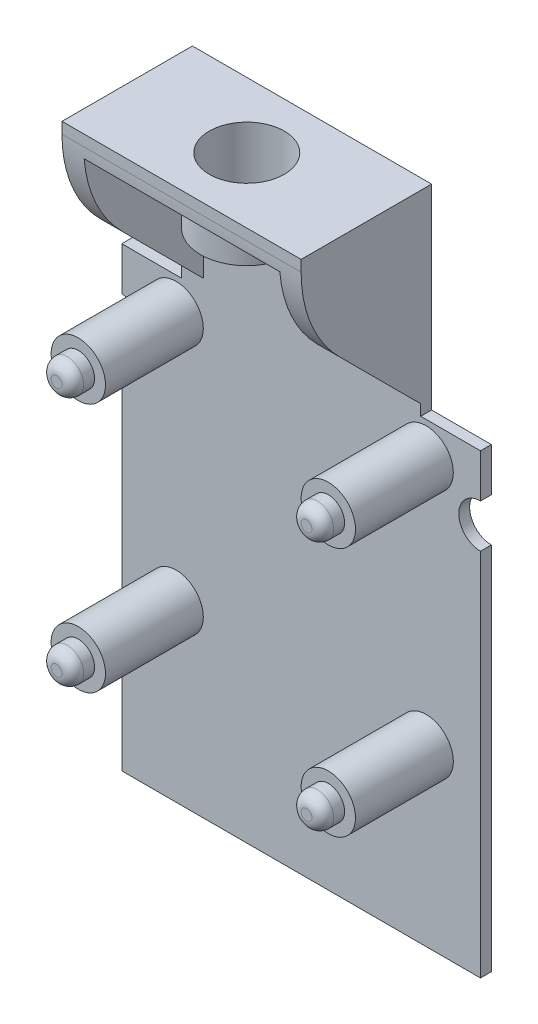
ISO-10303-21;
HEADER;
FILE_DESCRIPTION(('STEP AP214'),'2;1');
FILE_NAME('part.step','',(''),(''),'','','');
FILE_SCHEMA(('AUTOMOTIVE_DESIGN { 1 0 10303 214 1 1 1 1 }'));
ENDSEC;
DATA;
#1=APPLICATION_CONTEXT('core data for automotive mechanical design processes');
#2=APPLICATION_PROTOCOL_DEFINITION('international standard','automotive_design',2000,#1);
#3=PRODUCT_CONTEXT('',#1,'mechanical');
#4=PRODUCT('Part','Part','',(#3));
#5=PRODUCT_RELATED_PRODUCT_CATEGORY('part','',(#4));
#6=PRODUCT_DEFINITION_FORMATION('','',#4);
#7=PRODUCT_DEFINITION_CONTEXT('part definition',#1,'design');
#8=PRODUCT_DEFINITION('design','',#6,#7);
#9=PRODUCT_DEFINITION_SHAPE('','',#8);
#10=(LENGTH_UNIT() NAMED_UNIT(*) SI_UNIT(.MILLI.,.METRE.));
#11=(NAMED_UNIT(*) PLANE_ANGLE_UNIT() SI_UNIT($,.RADIAN.));
#12=(NAMED_UNIT(*) SI_UNIT($,.STERADIAN.) SOLID_ANGLE_UNIT());
#13=UNCERTAINTY_MEASURE_WITH_UNIT(LENGTH_MEASURE(1.E-05),#10,'distance_accuracy_value','');
#14=(GEOMETRIC_REPRESENTATION_CONTEXT(3) GLOBAL_UNCERTAINTY_ASSIGNED_CONTEXT((#13)) GLOBAL_UNIT_ASSIGNED_CONTEXT((#10,
#11,#12)) REPRESENTATION_CONTEXT('',''));
#15=CARTESIAN_POINT('',(0.,0.,0.));
#16=DIRECTION('',(0.,0.,1.));
#17=DIRECTION('',(1.,0.,0.));
#18=AXIS2_PLACEMENT_3D('',#15,#16,#17);
#19=CARTESIAN_POINT('',(0.,12.,1.));
#20=DIRECTION('',(0.,1.,0.));
#21=DIRECTION('',(0.,0.,1.));
#22=AXIS2_PLACEMENT_3D('',#19,#20,#21);
#23=PLANE('',#22);
#24=DIRECTION('',(1.,0.,0.));
#25=VECTOR('',#24,1.);
#26=CARTESIAN_POINT('',(0.,12.,1.));
#27=LINE('',#26,#25);
#28=CARTESIAN_POINT('',(-16.5,12.,1.));
#29=VERTEX_POINT('',#28);
#30=CARTESIAN_POINT('',(-11.,12.,1.));
#31=VERTEX_POINT('',#30);
#32=EDGE_CURVE('E256',#29,#31,#27,.T.);
#33=ORIENTED_EDGE('',*,*,#32,.T.);
#34=DIRECTION('',(0.,0.,-1.));
#35=VECTOR('',#34,1.);
#36=CARTESIAN_POINT('',(-11.,12.,12.));
#37=LINE('',#36,#35);
#38=CARTESIAN_POINT('',(-11.,12.,0.));
#39=VERTEX_POINT('',#38);
#40=EDGE_CURVE('E194',#31,#39,#37,.T.);
#41=ORIENTED_EDGE('',*,*,#40,.T.);
#42=DIRECTION('',(1.,0.,0.));
#43=VECTOR('',#42,1.);
#44=CARTESIAN_POINT('',(0.,12.,0.));
#45=LINE('',#44,#43);
#46=CARTESIAN_POINT('',(-16.5,12.,0.));
#47=VERTEX_POINT('',#46);
#48=EDGE_CURVE('E287',#47,#39,#45,.T.);
#49=ORIENTED_EDGE('',*,*,#48,.F.);
#50=DIRECTION('',(0.,0.,-1.));
#51=VECTOR('',#50,1.);
#52=CARTESIAN_POINT('',(-16.5,12.,1.));
#53=LINE('',#52,#51);
#54=EDGE_CURVE('E310',#29,#47,#53,.T.);
#55=ORIENTED_EDGE('',*,*,#54,.F.);
#56=EDGE_LOOP('',(#33,#41,#49,#55));
#57=FACE_BOUND('',#56,.T.);
#58=ADVANCED_FACE('F35',(#57),#23,.T.);
#59=CARTESIAN_POINT('',(16.5,5.99999999999997,1.));
#60=DIRECTION('',(0.,0.,-1.));
#61=DIRECTION('',(-1.,0.,0.));
#62=AXIS2_PLACEMENT_3D('',#59,#60,#61);
#63=CYLINDRICAL_SURFACE('',#62,2.);
#64=CARTESIAN_POINT('',(16.5,5.99999999999997,0.));
#65=DIRECTION('',(0.,0.,1.));
#66=DIRECTION('',(1.,0.,0.));
#67=AXIS2_PLACEMENT_3D('',#64,#65,#66);
#68=CIRCLE('',#67,2.);
#69=CARTESIAN_POINT('',(16.5,7.99999999999997,0.));
#70=VERTEX_POINT('',#69);
#71=CARTESIAN_POINT('',(16.5,3.99999999999997,0.));
#72=VERTEX_POINT('',#71);
#73=EDGE_CURVE('E235',#70,#72,#68,.T.);
#74=ORIENTED_EDGE('',*,*,#73,.F.);
#75=DIRECTION('',(0.,0.,-1.));
#76=VECTOR('',#75,1.);
#77=CARTESIAN_POINT('',(16.5,7.99999999999997,1.));
#78=LINE('',#77,#76);
#79=CARTESIAN_POINT('',(16.5,7.99999999999997,1.));
#80=VERTEX_POINT('',#79);
#81=EDGE_CURVE('E314',#80,#70,#78,.T.);
#82=ORIENTED_EDGE('',*,*,#81,.F.);
#83=CARTESIAN_POINT('',(16.5,5.99999999999997,1.));
#84=DIRECTION('',(0.,0.,1.));
#85=DIRECTION('',(1.,0.,0.));
#86=AXIS2_PLACEMENT_3D('',#83,#84,#85);
#87=CIRCLE('',#86,2.);
#88=CARTESIAN_POINT('',(16.5,3.99999999999997,1.));
#89=VERTEX_POINT('',#88);
#90=EDGE_CURVE('E236',#80,#89,#87,.T.);
#91=ORIENTED_EDGE('',*,*,#90,.T.);
#92=DIRECTION('',(0.,0.,-1.));
#93=VECTOR('',#92,1.);
#94=CARTESIAN_POINT('',(16.5,3.99999999999997,1.));
#95=LINE('',#94,#93);
#96=EDGE_CURVE('E278',#89,#72,#95,.T.);
#97=ORIENTED_EDGE('',*,*,#96,.T.);
#98=EDGE_LOOP('',(#74,#82,#91,#97));
#99=FACE_BOUND('',#98,.T.);
#100=ADVANCED_FACE('F437',(#99),#63,.F.);
#101=CARTESIAN_POINT('',(16.5,0.,1.));
#102=DIRECTION('',(1.,0.,0.));
#103=DIRECTION('',(0.,1.,0.));
#104=AXIS2_PLACEMENT_3D('',#101,#102,#103);
#105=PLANE('',#104);
#106=DIRECTION('',(0.,-1.,0.));
#107=VECTOR('',#106,1.);
#108=CARTESIAN_POINT('',(16.5,0.,0.));
#109=LINE('',#108,#107);
#110=CARTESIAN_POINT('',(16.5,12.,0.));
#111=VERTEX_POINT('',#110);
#112=EDGE_CURVE('E281',#111,#70,#109,.T.);
#113=ORIENTED_EDGE('',*,*,#112,.F.);
#114=DIRECTION('',(0.,0.,-1.));
#115=VECTOR('',#114,1.);
#116=CARTESIAN_POINT('',(16.5,12.,1.));
#117=LINE('',#116,#115);
#118=CARTESIAN_POINT('',(16.5,12.,1.));
#119=VERTEX_POINT('',#118);
#120=EDGE_CURVE('E312',#119,#111,#117,.T.);
#121=ORIENTED_EDGE('',*,*,#120,.F.);
#122=DIRECTION('',(0.,-1.,0.));
#123=VECTOR('',#122,1.);
#124=CARTESIAN_POINT('',(16.5,0.,1.));
#125=LINE('',#124,#123);
#126=EDGE_CURVE('E239',#119,#80,#125,.T.);
#127=ORIENTED_EDGE('',*,*,#126,.T.);
#128=ORIENTED_EDGE('',*,*,#81,.T.);
#129=EDGE_LOOP('',(#113,#121,#127,#128));
#130=FACE_BOUND('',#129,.T.);
#131=ADVANCED_FACE('F439',(#130),#105,.T.);
#132=CARTESIAN_POINT('',(0.,12.,1.));
#133=DIRECTION('',(0.,-1.,0.));
#134=DIRECTION('',(0.,0.,-1.));
#135=AXIS2_PLACEMENT_3D('',#132,#133,#134);
#136=PLANE('',#135);
#137=DIRECTION('',(-1.,0.,0.));
#138=VECTOR('',#137,1.);
#139=CARTESIAN_POINT('',(0.,12.,0.));
#140=LINE('',#139,#138);
#141=CARTESIAN_POINT('',(11.,12.,0.));
#142=VERTEX_POINT('',#141);
#143=EDGE_CURVE('E284',#111,#142,#140,.T.);
#144=ORIENTED_EDGE('',*,*,#143,.T.);
#145=DIRECTION('',(0.,0.,-1.));
#146=VECTOR('',#145,1.);
#147=CARTESIAN_POINT('',(11.,12.,12.));
#148=LINE('',#147,#146);
#149=CARTESIAN_POINT('',(11.,12.,1.));
#150=VERTEX_POINT('',#149);
#151=EDGE_CURVE('E176',#150,#142,#148,.T.);
#152=ORIENTED_EDGE('',*,*,#151,.F.);
#153=DIRECTION('',(-1.,0.,0.));
#154=VECTOR('',#153,1.);
#155=CARTESIAN_POINT('',(0.,12.,1.));
#156=LINE('',#155,#154);
#157=EDGE_CURVE('E243',#119,#150,#156,.T.);
#158=ORIENTED_EDGE('',*,*,#157,.F.);
#159=ORIENTED_EDGE('',*,*,#120,.T.);
#160=EDGE_LOOP('',(#144,#152,#158,#159));
#161=FACE_BOUND('',#160,.T.);
#162=ADVANCED_FACE('F401',(#161),#136,.F.);
#163=CARTESIAN_POINT('',(-16.5,0.,1.));
#164=DIRECTION('',(1.,0.,0.));
#165=DIRECTION('',(0.,1.,0.));
#166=AXIS2_PLACEMENT_3D('',#163,#164,#165);
#167=PLANE('',#166);
#168=DIRECTION('',(0.,-1.,0.));
#169=VECTOR('',#168,1.);
#170=CARTESIAN_POINT('',(-16.5,0.,0.));
#171=LINE('',#170,#169);
#172=CARTESIAN_POINT('',(-16.5,8.,0.));
#173=VERTEX_POINT('',#172);
#174=EDGE_CURVE('E290',#47,#173,#171,.T.);
#175=ORIENTED_EDGE('',*,*,#174,.T.);
#176=DIRECTION('',(0.,0.,-1.));
#177=VECTOR('',#176,1.);
#178=CARTESIAN_POINT('',(-16.5,8.,1.));
#179=LINE('',#178,#177);
#180=CARTESIAN_POINT('',(-16.5,8.,1.));
#181=VERTEX_POINT('',#180);
#182=EDGE_CURVE('E307',#181,#173,#179,.T.);
#183=ORIENTED_EDGE('',*,*,#182,.F.);
#184=DIRECTION('',(0.,-1.,0.));
#185=VECTOR('',#184,1.);
#186=CARTESIAN_POINT('',(-16.5,0.,1.));
#187=LINE('',#186,#185);
#188=EDGE_CURVE('E259',#29,#181,#187,.T.);
#189=ORIENTED_EDGE('',*,*,#188,.F.);
#190=ORIENTED_EDGE('',*,*,#54,.T.);
#191=EDGE_LOOP('',(#175,#183,#189,#190));
#192=FACE_BOUND('',#191,.T.);
#193=ADVANCED_FACE('F415',(#192),#167,.F.);
#194=CARTESIAN_POINT('',(-16.5,6.,1.));
#195=DIRECTION('',(0.,0.,-1.));
#196=DIRECTION('',(-1.,0.,0.));
#197=AXIS2_PLACEMENT_3D('',#194,#195,#196);
#198=CYLINDRICAL_SURFACE('',#197,2.);
#199=CARTESIAN_POINT('',(-16.5,6.,0.));
#200=DIRECTION('',(0.,0.,1.));
#201=DIRECTION('',(1.,0.,0.));
#202=AXIS2_PLACEMENT_3D('',#199,#200,#201);
#203=CIRCLE('',#202,2.);
#204=CARTESIAN_POINT('',(-16.5,4.,0.));
#205=VERTEX_POINT('',#204);
#206=EDGE_CURVE('E292',#173,#205,#203,.F.);
#207=ORIENTED_EDGE('',*,*,#206,.T.);
#208=DIRECTION('',(0.,0.,-1.));
#209=VECTOR('',#208,1.);
#210=CARTESIAN_POINT('',(-16.5,4.,1.));
#211=LINE('',#210,#209);
#212=CARTESIAN_POINT('',(-16.5,4.,1.));
#213=VERTEX_POINT('',#212);
#214=EDGE_CURVE('E304',#213,#205,#211,.T.);
#215=ORIENTED_EDGE('',*,*,#214,.F.);
#216=CARTESIAN_POINT('',(-16.5,6.,1.));
#217=DIRECTION('',(0.,0.,1.));
#218=DIRECTION('',(1.,0.,0.));
#219=AXIS2_PLACEMENT_3D('',#216,#217,#218);
#220=CIRCLE('',#219,2.);
#221=EDGE_CURVE('E261',#181,#213,#220,.F.);
#222=ORIENTED_EDGE('',*,*,#221,.F.);
#223=ORIENTED_EDGE('',*,*,#182,.T.);
#224=EDGE_LOOP('',(#207,#215,#222,#223));
#225=FACE_BOUND('',#224,.T.);
#226=ADVANCED_FACE('F418',(#225),#198,.F.);
#227=CARTESIAN_POINT('',(-16.5,-30.,0.));
#228=VERTEX_POINT('',#227);
#229=EDGE_CURVE('E293',#205,#228,#171,.T.);
#230=ORIENTED_EDGE('',*,*,#229,.T.);
#231=DIRECTION('',(0.,0.,-1.));
#232=VECTOR('',#231,1.);
#233=CARTESIAN_POINT('',(-16.5,-30.,1.));
#234=LINE('',#233,#232);
#235=CARTESIAN_POINT('',(-16.5,-30.,1.));
#236=VERTEX_POINT('',#235);
#237=EDGE_CURVE('E301',#236,#228,#234,.T.);
#238=ORIENTED_EDGE('',*,*,#237,.F.);
#239=EDGE_CURVE('E262',#213,#236,#187,.T.);
#240=ORIENTED_EDGE('',*,*,#239,.F.);
#241=ORIENTED_EDGE('',*,*,#214,.T.);
#242=EDGE_LOOP('',(#230,#238,#240,#241));
#243=FACE_BOUND('',#242,.T.);
#244=ADVANCED_FACE('F423',(#243),#167,.F.);
#245=CARTESIAN_POINT('',(0.,-30.,1.));
#246=DIRECTION('',(0.,1.,0.));
#247=DIRECTION('',(0.,0.,1.));
#248=AXIS2_PLACEMENT_3D('',#245,#246,#247);
#249=PLANE('',#248);
#250=DIRECTION('',(1.,0.,0.));
#251=VECTOR('',#250,1.);
#252=CARTESIAN_POINT('',(0.,-30.,0.));
#253=LINE('',#252,#251);
#254=CARTESIAN_POINT('',(16.5,-30.,0.));
#255=VERTEX_POINT('',#254);
#256=EDGE_CURVE('E295',#228,#255,#253,.T.);
#257=ORIENTED_EDGE('',*,*,#256,.T.);
#258=DIRECTION('',(0.,0.,-1.));
#259=VECTOR('',#258,1.);
#260=CARTESIAN_POINT('',(16.5,-30.,1.));
#261=LINE('',#260,#259);
#262=CARTESIAN_POINT('',(16.5,-30.,1.));
#263=VERTEX_POINT('',#262);
#264=EDGE_CURVE('E299',#263,#255,#261,.T.);
#265=ORIENTED_EDGE('',*,*,#264,.F.);
#266=DIRECTION('',(1.,0.,0.));
#267=VECTOR('',#266,1.);
#268=CARTESIAN_POINT('',(0.,-30.,1.));
#269=LINE('',#268,#267);
#270=EDGE_CURVE('E264',#236,#263,#269,.T.);
#271=ORIENTED_EDGE('',*,*,#270,.F.);
#272=ORIENTED_EDGE('',*,*,#237,.T.);
#273=EDGE_LOOP('',(#257,#265,#271,#272));
#274=FACE_BOUND('',#273,.T.);
#275=ADVANCED_FACE('F429',(#274),#249,.F.);
#276=EDGE_CURVE('E240',#72,#255,#109,.T.);
#277=ORIENTED_EDGE('',*,*,#276,.F.);
#278=ORIENTED_EDGE('',*,*,#96,.F.);
#279=EDGE_CURVE('E244',#89,#263,#125,.T.);
#280=ORIENTED_EDGE('',*,*,#279,.T.);
#281=ORIENTED_EDGE('',*,*,#264,.T.);
#282=EDGE_LOOP('',(#277,#278,#280,#281));
#283=FACE_BOUND('',#282,.T.);
#284=ADVANCED_FACE('F434',(#283),#105,.T.);
#285=CARTESIAN_POINT('',(0.,0.,1.));
#286=DIRECTION('',(0.,0.,1.));
#287=DIRECTION('',(1.,0.,0.));
#288=AXIS2_PLACEMENT_3D('',#285,#286,#287);
#289=PLANE('',#288);
#290=ORIENTED_EDGE('',*,*,#90,.F.);
#291=ORIENTED_EDGE('',*,*,#126,.F.);
#292=ORIENTED_EDGE('',*,*,#157,.T.);
#293=DIRECTION('',(0.,-1.,0.));
#294=VECTOR('',#293,1.);
#295=CARTESIAN_POINT('',(11.,0.,1.));
#296=LINE('',#295,#294);
#297=CARTESIAN_POINT('',(11.,13.0000000000002,1.));
#298=VERTEX_POINT('',#297);
#299=EDGE_CURVE('E352',#298,#150,#296,.T.);
#300=ORIENTED_EDGE('',*,*,#299,.F.);
#301=DIRECTION('',(1.,0.,0.));
#302=VECTOR('',#301,1.);
#303=CARTESIAN_POINT('',(0.,13.0000000000002,1.));
#304=LINE('',#303,#302);
#305=CARTESIAN_POINT('',(9.,13.0000000000002,1.));
#306=VERTEX_POINT('',#305);
#307=EDGE_CURVE('E356',#298,#306,#304,.F.);
#308=ORIENTED_EDGE('',*,*,#307,.T.);
#309=DIRECTION('',(0.,-1.,0.));
#310=VECTOR('',#309,1.);
#311=CARTESIAN_POINT('',(9.,0.,1.));
#312=LINE('',#311,#310);
#313=CARTESIAN_POINT('',(9.,28.,1.));
#314=VERTEX_POINT('',#313);
#315=EDGE_CURVE('E247',#314,#306,#312,.T.);
#316=ORIENTED_EDGE('',*,*,#315,.F.);
#317=DIRECTION('',(1.,0.,0.));
#318=VECTOR('',#317,1.);
#319=CARTESIAN_POINT('',(0.,28.,1.));
#320=LINE('',#319,#318);
#321=CARTESIAN_POINT('',(-9.,28.,1.));
#322=VERTEX_POINT('',#321);
#323=EDGE_CURVE('E250',#322,#314,#320,.T.);
#324=ORIENTED_EDGE('',*,*,#323,.F.);
#325=DIRECTION('',(0.,-1.,0.));
#326=VECTOR('',#325,1.);
#327=CARTESIAN_POINT('',(-9.,0.,1.));
#328=LINE('',#327,#326);
#329=CARTESIAN_POINT('',(-9.,13.0000000000001,1.));
#330=VERTEX_POINT('',#329);
#331=EDGE_CURVE('E253',#322,#330,#328,.T.);
#332=ORIENTED_EDGE('',*,*,#331,.T.);
#333=DIRECTION('',(-1.,0.,0.));
#334=VECTOR('',#333,1.);
#335=CARTESIAN_POINT('',(0.,13.0000000000001,1.));
#336=LINE('',#335,#334);
#337=CARTESIAN_POINT('',(-11.,13.0000000000001,1.));
#338=VERTEX_POINT('',#337);
#339=EDGE_CURVE('E354',#330,#338,#336,.T.);
#340=ORIENTED_EDGE('',*,*,#339,.T.);
#341=DIRECTION('',(0.,1.,0.));
#342=VECTOR('',#341,1.);
#343=CARTESIAN_POINT('',(-11.,0.,1.));
#344=LINE('',#343,#342);
#345=EDGE_CURVE('E344',#31,#338,#344,.T.);
#346=ORIENTED_EDGE('',*,*,#345,.F.);
#347=ORIENTED_EDGE('',*,*,#32,.F.);
#348=ORIENTED_EDGE('',*,*,#188,.T.);
#349=ORIENTED_EDGE('',*,*,#221,.T.);
#350=ORIENTED_EDGE('',*,*,#239,.T.);
#351=ORIENTED_EDGE('',*,*,#270,.T.);
#352=ORIENTED_EDGE('',*,*,#279,.F.);
#353=EDGE_LOOP('',(#290,#291,#292,#300,#308,#316,#324,#332,#340,#346,#347,#348,#349,#350,#351,#352));
#354=FACE_BOUND('',#353,.T.);
#355=CARTESIAN_POINT('',(-11.5,-14.,1.));
#356=DIRECTION('',(0.,0.,1.));
#357=DIRECTION('',(1.,0.,0.));
#358=AXIS2_PLACEMENT_3D('',#355,#356,#357);
#359=CIRCLE('',#358,2.5);
#360=CARTESIAN_POINT('',(-9.,-14.,1.));
#361=VERTEX_POINT('',#360);
#362=EDGE_CURVE('E266',#361,#361,#359,.T.);
#363=ORIENTED_EDGE('',*,*,#362,.F.);
#364=EDGE_LOOP('',(#363));
#365=FACE_BOUND('',#364,.T.);
#366=CARTESIAN_POINT('',(11.5,-14.,1.));
#367=DIRECTION('',(0.,0.,1.));
#368=DIRECTION('',(1.,0.,0.));
#369=AXIS2_PLACEMENT_3D('',#366,#367,#368);
#370=CIRCLE('',#369,2.5);
#371=CARTESIAN_POINT('',(14.,-14.,1.));
#372=VERTEX_POINT('',#371);
#373=EDGE_CURVE('E269',#372,#372,#370,.T.);
#374=ORIENTED_EDGE('',*,*,#373,.F.);
#375=EDGE_LOOP('',(#374));
#376=FACE_BOUND('',#375,.T.);
#377=CARTESIAN_POINT('',(11.5,9.,1.));
#378=DIRECTION('',(0.,0.,1.));
#379=DIRECTION('',(1.,0.,0.));
#380=AXIS2_PLACEMENT_3D('',#377,#378,#379);
#381=CIRCLE('',#380,2.5);
#382=CARTESIAN_POINT('',(14.,9.,1.));
#383=VERTEX_POINT('',#382);
#384=EDGE_CURVE('E272',#383,#383,#381,.T.);
#385=ORIENTED_EDGE('',*,*,#384,.F.);
#386=EDGE_LOOP('',(#385));
#387=FACE_BOUND('',#386,.T.);
#388=CARTESIAN_POINT('',(-11.5,9.,1.));
#389=DIRECTION('',(0.,0.,1.));
#390=DIRECTION('',(1.,0.,0.));
#391=AXIS2_PLACEMENT_3D('',#388,#389,#390);
#392=CIRCLE('',#391,2.5);
#393=CARTESIAN_POINT('',(-9.00000000000001,9.,1.));
#394=VERTEX_POINT('',#393);
#395=EDGE_CURVE('E275',#394,#394,#392,.T.);
#396=ORIENTED_EDGE('',*,*,#395,.F.);
#397=EDGE_LOOP('',(#396));
#398=FACE_BOUND('',#397,.T.);
#399=ADVANCED_FACE('F384',(#354,#365,#376,#387,#398),#289,.T.);
#400=CARTESIAN_POINT('',(0.,0.,0.));
#401=DIRECTION('',(0.,0.,1.));
#402=DIRECTION('',(1.,0.,0.));
#403=AXIS2_PLACEMENT_3D('',#400,#401,#402);
#404=PLANE('',#403);
#405=ORIENTED_EDGE('',*,*,#73,.T.);
#406=ORIENTED_EDGE('',*,*,#276,.T.);
#407=ORIENTED_EDGE('',*,*,#256,.F.);
#408=ORIENTED_EDGE('',*,*,#229,.F.);
#409=ORIENTED_EDGE('',*,*,#206,.F.);
#410=ORIENTED_EDGE('',*,*,#174,.F.);
#411=ORIENTED_EDGE('',*,*,#48,.T.);
#412=DIRECTION('',(0.,-1.,0.));
#413=VECTOR('',#412,1.);
#414=CARTESIAN_POINT('',(-11.,0.,0.));
#415=LINE('',#414,#413);
#416=CARTESIAN_POINT('',(-11.,30.,0.));
#417=VERTEX_POINT('',#416);
#418=EDGE_CURVE('E187',#417,#39,#415,.T.);
#419=ORIENTED_EDGE('',*,*,#418,.F.);
#420=DIRECTION('',(1.,0.,0.));
#421=VECTOR('',#420,1.);
#422=CARTESIAN_POINT('',(0.,30.,0.));
#423=LINE('',#422,#421);
#424=CARTESIAN_POINT('',(11.,30.,0.));
#425=VERTEX_POINT('',#424);
#426=EDGE_CURVE('E199',#417,#425,#423,.T.);
#427=ORIENTED_EDGE('',*,*,#426,.T.);
#428=DIRECTION('',(0.,-1.,0.));
#429=VECTOR('',#428,1.);
#430=CARTESIAN_POINT('',(11.,0.,0.));
#431=LINE('',#430,#429);
#432=EDGE_CURVE('E171',#425,#142,#431,.T.);
#433=ORIENTED_EDGE('',*,*,#432,.T.);
#434=ORIENTED_EDGE('',*,*,#143,.F.);
#435=ORIENTED_EDGE('',*,*,#112,.T.);
#436=EDGE_LOOP('',(#405,#406,#407,#408,#409,#410,#411,#419,#427,#433,#434,#435));
#437=FACE_BOUND('',#436,.T.);
#438=ADVANCED_FACE('F404',(#437),#404,.F.);
#439=CARTESIAN_POINT('',(11.5,9.,10.));
#440=DIRECTION('',(0.,0.,-1.));
#441=DIRECTION('',(-1.,0.,0.));
#442=AXIS2_PLACEMENT_3D('',#439,#440,#441);
#443=CYLINDRICAL_SURFACE('',#442,2.5);
#444=ORIENTED_EDGE('',*,*,#384,.T.);
#445=EDGE_LOOP('',(#444));
#446=FACE_BOUND('',#445,.T.);
#447=CARTESIAN_POINT('',(11.5,9.,10.));
#448=DIRECTION('',(0.,0.,1.));
#449=DIRECTION('',(1.,0.,0.));
#450=AXIS2_PLACEMENT_3D('',#447,#448,#449);
#451=CIRCLE('',#450,2.5);
#452=CARTESIAN_POINT('',(14.,9.,10.));
#453=VERTEX_POINT('',#452);
#454=EDGE_CURVE('E232',#453,#453,#451,.T.);
#455=ORIENTED_EDGE('',*,*,#454,.F.);
#456=EDGE_LOOP('',(#455));
#457=FACE_BOUND('',#456,.T.);
#458=ADVANCED_FACE('F570',(#446,#457),#443,.T.);
#459=CARTESIAN_POINT('',(0.,0.,10.));
#460=DIRECTION('',(0.,0.,1.));
#461=DIRECTION('',(1.,0.,0.));
#462=AXIS2_PLACEMENT_3D('',#459,#460,#461);
#463=PLANE('',#462);
#464=CARTESIAN_POINT('',(11.5,9.,10.));
#465=DIRECTION('',(0.,0.,1.));
#466=DIRECTION('',(1.,0.,0.));
#467=AXIS2_PLACEMENT_3D('',#464,#465,#466);
#468=CIRCLE('',#467,1.5);
#469=CARTESIAN_POINT('',(13.,9.,10.));
#470=VERTEX_POINT('',#469);
#471=EDGE_CURVE('E229',#470,#470,#468,.T.);
#472=ORIENTED_EDGE('',*,*,#471,.F.);
#473=EDGE_LOOP('',(#472));
#474=FACE_BOUND('',#473,.T.);
#475=ORIENTED_EDGE('',*,*,#454,.T.);
#476=EDGE_LOOP('',(#475));
#477=FACE_BOUND('',#476,.T.);
#478=ADVANCED_FACE('F566',(#474,#477),#463,.T.);
#479=CARTESIAN_POINT('',(-11.5,9.,10.));
#480=DIRECTION('',(0.,0.,-1.));
#481=DIRECTION('',(-1.,0.,0.));
#482=AXIS2_PLACEMENT_3D('',#479,#480,#481);
#483=CYLINDRICAL_SURFACE('',#482,2.5);
#484=ORIENTED_EDGE('',*,*,#395,.T.);
#485=EDGE_LOOP('',(#484));
#486=FACE_BOUND('',#485,.T.);
#487=CARTESIAN_POINT('',(-11.5,9.,10.));
#488=DIRECTION('',(0.,0.,1.));
#489=DIRECTION('',(1.,0.,0.));
#490=AXIS2_PLACEMENT_3D('',#487,#488,#489);
#491=CIRCLE('',#490,2.5);
#492=CARTESIAN_POINT('',(-9.00000000000001,9.,10.));
#493=VERTEX_POINT('',#492);
#494=EDGE_CURVE('E226',#493,#493,#491,.T.);
#495=ORIENTED_EDGE('',*,*,#494,.F.);
#496=EDGE_LOOP('',(#495));
#497=FACE_BOUND('',#496,.T.);
#498=ADVANCED_FACE('F562',(#486,#497),#483,.T.);
#499=CARTESIAN_POINT('',(0.,0.,10.));
#500=DIRECTION('',(0.,0.,1.));
#501=DIRECTION('',(1.,0.,0.));
#502=AXIS2_PLACEMENT_3D('',#499,#500,#501);
#503=PLANE('',#502);
#504=CARTESIAN_POINT('',(-11.5,9.,10.));
#505=DIRECTION('',(0.,0.,1.));
#506=DIRECTION('',(1.,0.,0.));
#507=AXIS2_PLACEMENT_3D('',#504,#505,#506);
#508=CIRCLE('',#507,1.5);
#509=CARTESIAN_POINT('',(-10.,9.,10.));
#510=VERTEX_POINT('',#509);
#511=EDGE_CURVE('E223',#510,#510,#508,.T.);
#512=ORIENTED_EDGE('',*,*,#511,.F.);
#513=EDGE_LOOP('',(#512));
#514=FACE_BOUND('',#513,.T.);
#515=ORIENTED_EDGE('',*,*,#494,.T.);
#516=EDGE_LOOP('',(#515));
#517=FACE_BOUND('',#516,.T.);
#518=ADVANCED_FACE('F558',(#514,#517),#503,.T.);
#519=CARTESIAN_POINT('',(-11.5,-14.,10.));
#520=DIRECTION('',(0.,0.,-1.));
#521=DIRECTION('',(-1.,0.,0.));
#522=AXIS2_PLACEMENT_3D('',#519,#520,#521);
#523=CYLINDRICAL_SURFACE('',#522,2.5);
#524=ORIENTED_EDGE('',*,*,#362,.T.);
#525=EDGE_LOOP('',(#524));
#526=FACE_BOUND('',#525,.T.);
#527=CARTESIAN_POINT('',(-11.5,-14.,10.));
#528=DIRECTION('',(0.,0.,1.));
#529=DIRECTION('',(1.,0.,0.));
#530=AXIS2_PLACEMENT_3D('',#527,#528,#529);
#531=CIRCLE('',#530,2.5);
#532=CARTESIAN_POINT('',(-9.,-14.,10.));
#533=VERTEX_POINT('',#532);
#534=EDGE_CURVE('E220',#533,#533,#531,.T.);
#535=ORIENTED_EDGE('',*,*,#534,.F.);
#536=EDGE_LOOP('',(#535));
#537=FACE_BOUND('',#536,.T.);
#538=ADVANCED_FACE('F554',(#526,#537),#523,.T.);
#539=CARTESIAN_POINT('',(0.,0.,10.));
#540=DIRECTION('',(0.,0.,1.));
#541=DIRECTION('',(1.,0.,0.));
#542=AXIS2_PLACEMENT_3D('',#539,#540,#541);
#543=PLANE('',#542);
#544=CARTESIAN_POINT('',(-11.5,-14.,10.));
#545=DIRECTION('',(0.,0.,1.));
#546=DIRECTION('',(1.,0.,0.));
#547=AXIS2_PLACEMENT_3D('',#544,#545,#546);
#548=CIRCLE('',#547,1.5);
#549=CARTESIAN_POINT('',(-10.,-14.,10.));
#550=VERTEX_POINT('',#549);
#551=EDGE_CURVE('E217',#550,#550,#548,.T.);
#552=ORIENTED_EDGE('',*,*,#551,.F.);
#553=EDGE_LOOP('',(#552));
#554=FACE_BOUND('',#553,.T.);
#555=ORIENTED_EDGE('',*,*,#534,.T.);
#556=EDGE_LOOP('',(#555));
#557=FACE_BOUND('',#556,.T.);
#558=ADVANCED_FACE('F550',(#554,#557),#543,.T.);
#559=CARTESIAN_POINT('',(11.5,-14.,10.));
#560=DIRECTION('',(0.,0.,-1.));
#561=DIRECTION('',(-1.,0.,0.));
#562=AXIS2_PLACEMENT_3D('',#559,#560,#561);
#563=CYLINDRICAL_SURFACE('',#562,2.5);
#564=ORIENTED_EDGE('',*,*,#373,.T.);
#565=EDGE_LOOP('',(#564));
#566=FACE_BOUND('',#565,.T.);
#567=CARTESIAN_POINT('',(11.5,-14.,10.));
#568=DIRECTION('',(0.,0.,1.));
#569=DIRECTION('',(1.,0.,0.));
#570=AXIS2_PLACEMENT_3D('',#567,#568,#569);
#571=CIRCLE('',#570,2.5);
#572=CARTESIAN_POINT('',(14.,-14.,10.));
#573=VERTEX_POINT('',#572);
#574=EDGE_CURVE('E214',#573,#573,#571,.T.);
#575=ORIENTED_EDGE('',*,*,#574,.F.);
#576=EDGE_LOOP('',(#575));
#577=FACE_BOUND('',#576,.T.);
#578=ADVANCED_FACE('F546',(#566,#577),#563,.T.);
#579=CARTESIAN_POINT('',(0.,0.,10.));
#580=DIRECTION('',(0.,0.,1.));
#581=DIRECTION('',(1.,0.,0.));
#582=AXIS2_PLACEMENT_3D('',#579,#580,#581);
#583=PLANE('',#582);
#584=CARTESIAN_POINT('',(11.5,-14.,10.));
#585=DIRECTION('',(0.,0.,1.));
#586=DIRECTION('',(1.,0.,0.));
#587=AXIS2_PLACEMENT_3D('',#584,#585,#586);
#588=CIRCLE('',#587,1.5);
#589=CARTESIAN_POINT('',(13.,-14.,10.));
#590=VERTEX_POINT('',#589);
#591=EDGE_CURVE('E211',#590,#590,#588,.T.);
#592=ORIENTED_EDGE('',*,*,#591,.F.);
#593=EDGE_LOOP('',(#592));
#594=FACE_BOUND('',#593,.T.);
#595=ORIENTED_EDGE('',*,*,#574,.T.);
#596=EDGE_LOOP('',(#595));
#597=FACE_BOUND('',#596,.T.);
#598=ADVANCED_FACE('F539',(#594,#597),#583,.T.);
#599=CARTESIAN_POINT('',(0.,0.,12.));
#600=DIRECTION('',(0.,0.,1.));
#601=DIRECTION('',(1.,0.,0.));
#602=AXIS2_PLACEMENT_3D('',#599,#600,#601);
#603=PLANE('',#602);
#604=CARTESIAN_POINT('',(-11.5,9.,12.));
#605=DIRECTION('',(0.,0.,1.));
#606=DIRECTION('',(1.,0.,0.));
#607=AXIS2_PLACEMENT_3D('',#604,#605,#606);
#608=CIRCLE('',#607,0.499999999999999);
#609=CARTESIAN_POINT('',(-11.,9.,12.));
#610=VERTEX_POINT('',#609);
#611=EDGE_CURVE('E334',#610,#610,#608,.T.);
#612=ORIENTED_EDGE('',*,*,#611,.T.);
#613=EDGE_LOOP('',(#612));
#614=FACE_BOUND('',#613,.T.);
#615=ADVANCED_FACE('F536',(#614),#603,.T.);
#616=CARTESIAN_POINT('',(-11.5,9.,12.));
#617=DIRECTION('',(0.,0.,-1.));
#618=DIRECTION('',(-1.,0.,0.));
#619=AXIS2_PLACEMENT_3D('',#616,#617,#618);
#620=CYLINDRICAL_SURFACE('',#619,1.5);
#621=CARTESIAN_POINT('',(-11.5,9.,11.));
#622=DIRECTION('',(0.,0.,1.));
#623=DIRECTION('',(1.,0.,0.));
#624=AXIS2_PLACEMENT_3D('',#621,#622,#623);
#625=CIRCLE('',#624,1.5);
#626=CARTESIAN_POINT('',(-10.,9.,11.));
#627=VERTEX_POINT('',#626);
#628=EDGE_CURVE('E337',#627,#627,#625,.F.);
#629=ORIENTED_EDGE('',*,*,#628,.T.);
#630=EDGE_LOOP('',(#629));
#631=FACE_BOUND('',#630,.T.);
#632=ORIENTED_EDGE('',*,*,#511,.T.);
#633=EDGE_LOOP('',(#632));
#634=FACE_BOUND('',#633,.T.);
#635=ADVANCED_FACE('F531',(#631,#634),#620,.T.);
#636=CARTESIAN_POINT('',(0.,0.,12.));
#637=DIRECTION('',(0.,0.,1.));
#638=DIRECTION('',(1.,0.,0.));
#639=AXIS2_PLACEMENT_3D('',#636,#637,#638);
#640=PLANE('',#639);
#641=CARTESIAN_POINT('',(11.5,9.,12.));
#642=DIRECTION('',(0.,0.,1.));
#643=DIRECTION('',(1.,0.,0.));
#644=AXIS2_PLACEMENT_3D('',#641,#642,#643);
#645=CIRCLE('',#644,0.499999999999999);
#646=CARTESIAN_POINT('',(12.,9.,12.));
#647=VERTEX_POINT('',#646);
#648=EDGE_CURVE('E328',#647,#647,#645,.T.);
#649=ORIENTED_EDGE('',*,*,#648,.T.);
#650=EDGE_LOOP('',(#649));
#651=FACE_BOUND('',#650,.T.);
#652=ADVANCED_FACE('F528',(#651),#640,.T.);
#653=CARTESIAN_POINT('',(11.5,9.,12.));
#654=DIRECTION('',(0.,0.,-1.));
#655=DIRECTION('',(-1.,0.,0.));
#656=AXIS2_PLACEMENT_3D('',#653,#654,#655);
#657=CYLINDRICAL_SURFACE('',#656,1.5);
#658=CARTESIAN_POINT('',(11.5,9.,11.));
#659=DIRECTION('',(0.,0.,1.));
#660=DIRECTION('',(1.,0.,0.));
#661=AXIS2_PLACEMENT_3D('',#658,#659,#660);
#662=CIRCLE('',#661,1.5);
#663=CARTESIAN_POINT('',(13.,9.,11.));
#664=VERTEX_POINT('',#663);
#665=EDGE_CURVE('E331',#664,#664,#662,.F.);
#666=ORIENTED_EDGE('',*,*,#665,.T.);
#667=EDGE_LOOP('',(#666));
#668=FACE_BOUND('',#667,.T.);
#669=ORIENTED_EDGE('',*,*,#471,.T.);
#670=EDGE_LOOP('',(#669));
#671=FACE_BOUND('',#670,.T.);
#672=ADVANCED_FACE('F523',(#668,#671),#657,.T.);
#673=CARTESIAN_POINT('',(0.,0.,12.));
#674=DIRECTION('',(0.,0.,1.));
#675=DIRECTION('',(1.,0.,0.));
#676=AXIS2_PLACEMENT_3D('',#673,#674,#675);
#677=PLANE('',#676);
#678=CARTESIAN_POINT('',(-11.5,-14.,12.));
#679=DIRECTION('',(0.,0.,1.));
#680=DIRECTION('',(1.,0.,0.));
#681=AXIS2_PLACEMENT_3D('',#678,#679,#680);
#682=CIRCLE('',#681,0.499999999999999);
#683=CARTESIAN_POINT('',(-11.,-14.,12.));
#684=VERTEX_POINT('',#683);
#685=EDGE_CURVE('E322',#684,#684,#682,.T.);
#686=ORIENTED_EDGE('',*,*,#685,.T.);
#687=EDGE_LOOP('',(#686));
#688=FACE_BOUND('',#687,.T.);
#689=ADVANCED_FACE('F520',(#688),#677,.T.);
#690=CARTESIAN_POINT('',(-11.5,-14.,12.));
#691=DIRECTION('',(0.,0.,-1.));
#692=DIRECTION('',(-1.,0.,0.));
#693=AXIS2_PLACEMENT_3D('',#690,#691,#692);
#694=CYLINDRICAL_SURFACE('',#693,1.5);
#695=CARTESIAN_POINT('',(-11.5,-14.,11.));
#696=DIRECTION('',(0.,0.,1.));
#697=DIRECTION('',(1.,0.,0.));
#698=AXIS2_PLACEMENT_3D('',#695,#696,#697);
#699=CIRCLE('',#698,1.5);
#700=CARTESIAN_POINT('',(-10.,-14.,11.));
#701=VERTEX_POINT('',#700);
#702=EDGE_CURVE('E325',#701,#701,#699,.F.);
#703=ORIENTED_EDGE('',*,*,#702,.T.);
#704=EDGE_LOOP('',(#703));
#705=FACE_BOUND('',#704,.T.);
#706=ORIENTED_EDGE('',*,*,#551,.T.);
#707=EDGE_LOOP('',(#706));
#708=FACE_BOUND('',#707,.T.);
#709=ADVANCED_FACE('F515',(#705,#708),#694,.T.);
#710=CARTESIAN_POINT('',(0.,0.,12.));
#711=DIRECTION('',(0.,0.,1.));
#712=DIRECTION('',(1.,0.,0.));
#713=AXIS2_PLACEMENT_3D('',#710,#711,#712);
#714=PLANE('',#713);
#715=CARTESIAN_POINT('',(11.5,-14.,12.));
#716=DIRECTION('',(0.,0.,1.));
#717=DIRECTION('',(1.,0.,0.));
#718=AXIS2_PLACEMENT_3D('',#715,#716,#717);
#719=CIRCLE('',#718,0.499999999999999);
#720=CARTESIAN_POINT('',(12.,-14.,12.));
#721=VERTEX_POINT('',#720);
#722=EDGE_CURVE('E316',#721,#721,#719,.T.);
#723=ORIENTED_EDGE('',*,*,#722,.T.);
#724=EDGE_LOOP('',(#723));
#725=FACE_BOUND('',#724,.T.);
#726=ADVANCED_FACE('F512',(#725),#714,.T.);
#727=CARTESIAN_POINT('',(11.5,-14.,12.));
#728=DIRECTION('',(0.,0.,-1.));
#729=DIRECTION('',(-1.,0.,0.));
#730=AXIS2_PLACEMENT_3D('',#727,#728,#729);
#731=CYLINDRICAL_SURFACE('',#730,1.5);
#732=CARTESIAN_POINT('',(11.5,-14.,11.));
#733=DIRECTION('',(0.,0.,1.));
#734=DIRECTION('',(1.,0.,0.));
#735=AXIS2_PLACEMENT_3D('',#732,#733,#734);
#736=CIRCLE('',#735,1.5);
#737=CARTESIAN_POINT('',(13.,-14.,11.));
#738=VERTEX_POINT('',#737);
#739=EDGE_CURVE('E319',#738,#738,#736,.F.);
#740=ORIENTED_EDGE('',*,*,#739,.T.);
#741=EDGE_LOOP('',(#740));
#742=FACE_BOUND('',#741,.T.);
#743=ORIENTED_EDGE('',*,*,#591,.T.);
#744=EDGE_LOOP('',(#743));
#745=FACE_BOUND('',#744,.T.);
#746=ADVANCED_FACE('F462',(#742,#745),#731,.T.);
#747=CARTESIAN_POINT('',(11.5,-14.,11.));
#748=DIRECTION('',(0.,0.,1.));
#749=DIRECTION('',(1.,0.,0.));
#750=AXIS2_PLACEMENT_3D('',#747,#748,#749);
#751=DEGENERATE_TOROIDAL_SURFACE('',#750,0.499999999999999,1.,.T.);
#752=ORIENTED_EDGE('',*,*,#739,.F.);
#753=EDGE_LOOP('',(#752));
#754=FACE_BOUND('',#753,.T.);
#755=ORIENTED_EDGE('',*,*,#722,.F.);
#756=EDGE_LOOP('',(#755));
#757=FACE_BOUND('',#756,.T.);
#758=ADVANCED_FACE('F458',(#754,#757),#751,.T.);
#759=CARTESIAN_POINT('',(-11.5,-14.,11.));
#760=DIRECTION('',(0.,0.,1.));
#761=DIRECTION('',(1.,0.,0.));
#762=AXIS2_PLACEMENT_3D('',#759,#760,#761);
#763=DEGENERATE_TOROIDAL_SURFACE('',#762,0.499999999999999,1.,.T.);
#764=ORIENTED_EDGE('',*,*,#702,.F.);
#765=EDGE_LOOP('',(#764));
#766=FACE_BOUND('',#765,.T.);
#767=ORIENTED_EDGE('',*,*,#685,.F.);
#768=EDGE_LOOP('',(#767));
#769=FACE_BOUND('',#768,.T.);
#770=ADVANCED_FACE('F461',(#766,#769),#763,.T.);
#771=CARTESIAN_POINT('',(11.5,9.,11.));
#772=DIRECTION('',(0.,0.,1.));
#773=DIRECTION('',(1.,0.,0.));
#774=AXIS2_PLACEMENT_3D('',#771,#772,#773);
#775=DEGENERATE_TOROIDAL_SURFACE('',#774,0.499999999999999,1.,.T.);
#776=ORIENTED_EDGE('',*,*,#665,.F.);
#777=EDGE_LOOP('',(#776));
#778=FACE_BOUND('',#777,.T.);
#779=ORIENTED_EDGE('',*,*,#648,.F.);
#780=EDGE_LOOP('',(#779));
#781=FACE_BOUND('',#780,.T.);
#782=ADVANCED_FACE('F466',(#778,#781),#775,.T.);
#783=CARTESIAN_POINT('',(-11.5,9.,11.));
#784=DIRECTION('',(0.,0.,1.));
#785=DIRECTION('',(1.,0.,0.));
#786=AXIS2_PLACEMENT_3D('',#783,#784,#785);
#787=DEGENERATE_TOROIDAL_SURFACE('',#786,0.499999999999999,1.,.T.);
#788=ORIENTED_EDGE('',*,*,#628,.F.);
#789=EDGE_LOOP('',(#788));
#790=FACE_BOUND('',#789,.T.);
#791=ORIENTED_EDGE('',*,*,#611,.F.);
#792=EDGE_LOOP('',(#791));
#793=FACE_BOUND('',#792,.T.);
#794=ADVANCED_FACE('F470',(#790,#793),#787,.T.);
#795=CARTESIAN_POINT('',(-9.,0.,12.));
#796=DIRECTION('',(1.,0.,0.));
#797=DIRECTION('',(0.,1.,0.));
#798=AXIS2_PLACEMENT_3D('',#795,#796,#797);
#799=PLANE('',#798);
#800=DIRECTION('',(0.,0.,-1.));
#801=VECTOR('',#800,1.);
#802=CARTESIAN_POINT('',(-9.,28.,12.));
#803=LINE('',#802,#801);
#804=CARTESIAN_POINT('',(-9.,28.,11.9606859314702));
#805=VERTEX_POINT('',#804);
#806=EDGE_CURVE('E209',#805,#322,#803,.T.);
#807=ORIENTED_EDGE('',*,*,#806,.F.);
#808=CARTESIAN_POINT('',(-9.,28.9705627484773,0.));
#809=DIRECTION('',(1.,0.,0.));
#810=DIRECTION('',(0.,1.,0.));
#811=AXIS2_PLACEMENT_3D('',#808,#809,#810);
#812=CIRCLE('',#811,12.);
#813=CARTESIAN_POINT('',(-9.,20.4852813742388,8.48528137423862));
#814=VERTEX_POINT('',#813);
#815=EDGE_CURVE('E57',#805,#814,#812,.T.);
#816=ORIENTED_EDGE('',*,*,#815,.T.);
#817=DIRECTION('',(0.,-0.707106781186551,-0.707106781186544));
#818=VECTOR('',#817,1.);
#819=CARTESIAN_POINT('',(-9.,12.,-1.05818132034585E-13));
#820=LINE('',#819,#818);
#821=EDGE_CURVE('E340',#814,#330,#820,.T.);
#822=ORIENTED_EDGE('',*,*,#821,.T.);
#823=ORIENTED_EDGE('',*,*,#331,.F.);
#824=EDGE_LOOP('',(#807,#816,#822,#823));
#825=FACE_BOUND('',#824,.T.);
#826=ADVANCED_FACE('F374',(#825),#799,.T.);
#827=CARTESIAN_POINT('',(0.,28.,12.));
#828=DIRECTION('',(0.,1.,0.));
#829=DIRECTION('',(0.,0.,1.));
#830=AXIS2_PLACEMENT_3D('',#827,#828,#829);
#831=PLANE('',#830);
#832=CARTESIAN_POINT('',(0.,28.,6.));
#833=DIRECTION('',(0.,1.,0.));
#834=DIRECTION('',(0.,0.,1.));
#835=AXIS2_PLACEMENT_3D('',#832,#833,#834);
#836=CIRCLE('',#835,4.25);
#837=CARTESIAN_POINT('',(0.,28.,10.25));
#838=VERTEX_POINT('',#837);
#839=EDGE_CURVE('E735',#838,#838,#836,.T.);
#840=ORIENTED_EDGE('',*,*,#839,.T.);
#841=EDGE_LOOP('',(#840));
#842=FACE_BOUND('',#841,.T.);
#843=DIRECTION('',(0.,0.,-1.));
#844=VECTOR('',#843,1.);
#845=CARTESIAN_POINT('',(9.,28.,12.));
#846=LINE('',#845,#844);
#847=CARTESIAN_POINT('',(9.,28.,11.9606859314702));
#848=VERTEX_POINT('',#847);
#849=EDGE_CURVE('E207',#848,#314,#846,.T.);
#850=ORIENTED_EDGE('',*,*,#849,.F.);
#851=DIRECTION('',(1.,0.,0.));
#852=VECTOR('',#851,1.);
#853=CARTESIAN_POINT('',(9.,28.,11.9606859314702));
#854=LINE('',#853,#852);
#855=EDGE_CURVE('E366',#848,#805,#854,.F.);
#856=ORIENTED_EDGE('',*,*,#855,.T.);
#857=ORIENTED_EDGE('',*,*,#806,.T.);
#858=ORIENTED_EDGE('',*,*,#323,.T.);
#859=EDGE_LOOP('',(#850,#856,#857,#858));
#860=FACE_BOUND('',#859,.T.);
#861=ADVANCED_FACE('F370',(#842,#860),#831,.F.);
#862=CARTESIAN_POINT('',(9.,0.,12.));
#863=DIRECTION('',(1.,0.,0.));
#864=DIRECTION('',(0.,1.,0.));
#865=AXIS2_PLACEMENT_3D('',#862,#863,#864);
#866=PLANE('',#865);
#867=DIRECTION('',(0.,-0.707106781186544,-0.707106781186551));
#868=VECTOR('',#867,1.);
#869=CARTESIAN_POINT('',(9.,12.,-2.09413649615575E-13));
#870=LINE('',#869,#868);
#871=CARTESIAN_POINT('',(9.,20.4852813742387,8.48528137423853));
#872=VERTEX_POINT('',#871);
#873=EDGE_CURVE('E347',#306,#872,#870,.F.);
#874=ORIENTED_EDGE('',*,*,#873,.T.);
#875=CARTESIAN_POINT('',(9.,28.9705627484773,0.));
#876=DIRECTION('',(1.,0.,0.));
#877=DIRECTION('',(0.,1.,0.));
#878=AXIS2_PLACEMENT_3D('',#875,#876,#877);
#879=CIRCLE('',#878,12.);
#880=EDGE_CURVE('E363',#872,#848,#879,.F.);
#881=ORIENTED_EDGE('',*,*,#880,.T.);
#882=ORIENTED_EDGE('',*,*,#849,.T.);
#883=ORIENTED_EDGE('',*,*,#315,.T.);
#884=EDGE_LOOP('',(#874,#881,#882,#883));
#885=FACE_BOUND('',#884,.T.);
#886=ADVANCED_FACE('F392',(#885),#866,.F.);
#887=CARTESIAN_POINT('',(11.,0.,12.));
#888=DIRECTION('',(1.,0.,0.));
#889=DIRECTION('',(0.,1.,0.));
#890=AXIS2_PLACEMENT_3D('',#887,#888,#889);
#891=PLANE('',#890);
#892=DIRECTION('',(0.,-1.,0.));
#893=VECTOR('',#892,1.);
#894=CARTESIAN_POINT('',(11.,0.,12.));
#895=LINE('',#894,#893);
#896=CARTESIAN_POINT('',(11.,30.,12.));
#897=VERTEX_POINT('',#896);
#898=CARTESIAN_POINT('',(11.,28.9705627484773,12.));
#899=VERTEX_POINT('',#898);
#900=EDGE_CURVE('E169',#897,#899,#895,.T.);
#901=ORIENTED_EDGE('',*,*,#900,.T.);
#902=CARTESIAN_POINT('',(11.,28.9705627484773,0.));
#903=DIRECTION('',(1.,0.,0.));
#904=DIRECTION('',(0.,1.,0.));
#905=AXIS2_PLACEMENT_3D('',#902,#903,#904);
#906=CIRCLE('',#905,12.);
#907=CARTESIAN_POINT('',(11.,20.4852813742387,8.48528137423853));
#908=VERTEX_POINT('',#907);
#909=EDGE_CURVE('E359',#899,#908,#906,.T.);
#910=ORIENTED_EDGE('',*,*,#909,.T.);
#911=DIRECTION('',(0.,0.707106781186544,0.707106781186551));
#912=VECTOR('',#911,1.);
#913=CARTESIAN_POINT('',(11.,12.0000000000002,0.));
#914=LINE('',#913,#912);
#915=EDGE_CURVE('E350',#908,#298,#914,.F.);
#916=ORIENTED_EDGE('',*,*,#915,.T.);
#917=ORIENTED_EDGE('',*,*,#299,.T.);
#918=ORIENTED_EDGE('',*,*,#151,.T.);
#919=ORIENTED_EDGE('',*,*,#432,.F.);
#920=DIRECTION('',(0.,0.,-1.));
#921=VECTOR('',#920,1.);
#922=CARTESIAN_POINT('',(11.,30.,12.));
#923=LINE('',#922,#921);
#924=EDGE_CURVE('E166',#897,#425,#923,.T.);
#925=ORIENTED_EDGE('',*,*,#924,.F.);
#926=EDGE_LOOP('',(#901,#910,#916,#917,#918,#919,#925));
#927=FACE_BOUND('',#926,.T.);
#928=ADVANCED_FACE('F168',(#927),#891,.T.);
#929=CARTESIAN_POINT('',(0.,30.,12.));
#930=DIRECTION('',(0.,1.,0.));
#931=DIRECTION('',(0.,0.,1.));
#932=AXIS2_PLACEMENT_3D('',#929,#930,#931);
#933=PLANE('',#932);
#934=ORIENTED_EDGE('',*,*,#426,.F.);
#935=DIRECTION('',(0.,0.,-1.));
#936=VECTOR('',#935,1.);
#937=CARTESIAN_POINT('',(-11.,30.,12.));
#938=LINE('',#937,#936);
#939=CARTESIAN_POINT('',(-11.,30.,12.));
#940=VERTEX_POINT('',#939);
#941=EDGE_CURVE('E177',#940,#417,#938,.T.);
#942=ORIENTED_EDGE('',*,*,#941,.F.);
#943=DIRECTION('',(1.,0.,0.));
#944=VECTOR('',#943,1.);
#945=CARTESIAN_POINT('',(0.,30.,12.));
#946=LINE('',#945,#944);
#947=EDGE_CURVE('E183',#940,#897,#946,.T.);
#948=ORIENTED_EDGE('',*,*,#947,.T.);
#949=ORIENTED_EDGE('',*,*,#924,.T.);
#950=EDGE_LOOP('',(#934,#942,#948,#949));
#951=FACE_BOUND('',#950,.T.);
#952=CARTESIAN_POINT('',(0.,30.,6.));
#953=DIRECTION('',(0.,1.,0.));
#954=DIRECTION('',(0.,0.,1.));
#955=AXIS2_PLACEMENT_3D('',#952,#953,#954);
#956=CIRCLE('',#955,3.45);
#957=CARTESIAN_POINT('',(0.,30.,9.45));
#958=VERTEX_POINT('',#957);
#959=EDGE_CURVE('E200',#958,#958,#956,.T.);
#960=ORIENTED_EDGE('',*,*,#959,.F.);
#961=EDGE_LOOP('',(#960));
#962=FACE_BOUND('',#961,.T.);
#963=ADVANCED_FACE('F189',(#951,#962),#933,.T.);
#964=CARTESIAN_POINT('',(-11.,0.,12.));
#965=DIRECTION('',(1.,0.,0.));
#966=DIRECTION('',(0.,1.,0.));
#967=AXIS2_PLACEMENT_3D('',#964,#965,#966);
#968=PLANE('',#967);
#969=DIRECTION('',(0.,0.707106781186551,0.707106781186544));
#970=VECTOR('',#969,1.);
#971=CARTESIAN_POINT('',(-11.,24.0000000000002,12.));
#972=LINE('',#971,#970);
#973=CARTESIAN_POINT('',(-11.,20.4852813742388,8.48528137423861));
#974=VERTEX_POINT('',#973);
#975=EDGE_CURVE('E342',#338,#974,#972,.T.);
#976=ORIENTED_EDGE('',*,*,#975,.T.);
#977=CARTESIAN_POINT('',(-11.,28.9705627484773,0.));
#978=DIRECTION('',(1.,0.,0.));
#979=DIRECTION('',(0.,1.,0.));
#980=AXIS2_PLACEMENT_3D('',#977,#978,#979);
#981=CIRCLE('',#980,12.);
#982=CARTESIAN_POINT('',(-11.,28.9705627484773,12.));
#983=VERTEX_POINT('',#982);
#984=EDGE_CURVE('E11',#974,#983,#981,.F.);
#985=ORIENTED_EDGE('',*,*,#984,.T.);
#986=DIRECTION('',(0.,-1.,0.));
#987=VECTOR('',#986,1.);
#988=CARTESIAN_POINT('',(-11.,0.,12.));
#989=LINE('',#988,#987);
#990=EDGE_CURVE('E192',#940,#983,#989,.T.);
#991=ORIENTED_EDGE('',*,*,#990,.F.);
#992=ORIENTED_EDGE('',*,*,#941,.T.);
#993=ORIENTED_EDGE('',*,*,#418,.T.);
#994=ORIENTED_EDGE('',*,*,#40,.F.);
#995=ORIENTED_EDGE('',*,*,#345,.T.);
#996=EDGE_LOOP('',(#976,#985,#991,#992,#993,#994,#995));
#997=FACE_BOUND('',#996,.T.);
#998=ADVANCED_FACE('F378',(#997),#968,.F.);
#999=CARTESIAN_POINT('',(0.,0.,12.));
#1000=DIRECTION('',(0.,0.,1.));
#1001=DIRECTION('',(1.,0.,0.));
#1002=AXIS2_PLACEMENT_3D('',#999,#1000,#1001);
#1003=PLANE('',#1002);
#1004=DIRECTION('',(1.,0.,0.));
#1005=VECTOR('',#1004,1.);
#1006=CARTESIAN_POINT('',(0.,28.9705627484773,12.));
#1007=LINE('',#1006,#1005);
#1008=EDGE_CURVE('E185',#983,#899,#1007,.T.);
#1009=ORIENTED_EDGE('',*,*,#1008,.T.);
#1010=ORIENTED_EDGE('',*,*,#900,.F.);
#1011=ORIENTED_EDGE('',*,*,#947,.F.);
#1012=ORIENTED_EDGE('',*,*,#990,.T.);
#1013=EDGE_LOOP('',(#1009,#1010,#1011,#1012));
#1014=FACE_BOUND('',#1013,.T.);
#1015=ADVANCED_FACE('F181',(#1014),#1003,.T.);
#1016=CARTESIAN_POINT('',(0.,24.0000000000002,12.));
#1017=DIRECTION('',(0.,-0.707106781186544,0.707106781186551));
#1018=DIRECTION('',(-1.,0.,0.));
#1019=AXIS2_PLACEMENT_3D('',#1016,#1017,#1018);
#1020=PLANE('',#1019);
#1021=ORIENTED_EDGE('',*,*,#821,.F.);
#1022=DIRECTION('',(1.,0.,0.));
#1023=VECTOR('',#1022,1.);
#1024=CARTESIAN_POINT('',(0.,20.4852813742388,8.48528137423861));
#1025=LINE('',#1024,#1023);
#1026=EDGE_CURVE('E43',#814,#974,#1025,.F.);
#1027=ORIENTED_EDGE('',*,*,#1026,.T.);
#1028=ORIENTED_EDGE('',*,*,#975,.F.);
#1029=ORIENTED_EDGE('',*,*,#339,.F.);
#1030=EDGE_LOOP('',(#1021,#1027,#1028,#1029));
#1031=FACE_BOUND('',#1030,.T.);
#1032=ADVANCED_FACE('F381',(#1031),#1020,.T.);
#1033=CARTESIAN_POINT('',(0.,12.,-2.09901540593194E-13));
#1034=DIRECTION('',(0.,0.707106781186551,-0.707106781186544));
#1035=DIRECTION('',(-1.,0.,0.));
#1036=AXIS2_PLACEMENT_3D('',#1033,#1034,#1035);
#1037=PLANE('',#1036);
#1038=ORIENTED_EDGE('',*,*,#915,.F.);
#1039=DIRECTION('',(1.,0.,0.));
#1040=VECTOR('',#1039,1.);
#1041=CARTESIAN_POINT('',(0.,20.4852813742387,8.48528137423853));
#1042=LINE('',#1041,#1040);
#1043=EDGE_CURVE('E361',#908,#872,#1042,.F.);
#1044=ORIENTED_EDGE('',*,*,#1043,.T.);
#1045=ORIENTED_EDGE('',*,*,#873,.F.);
#1046=ORIENTED_EDGE('',*,*,#307,.F.);
#1047=EDGE_LOOP('',(#1038,#1044,#1045,#1046));
#1048=FACE_BOUND('',#1047,.T.);
#1049=ADVANCED_FACE('F395',(#1048),#1037,.F.);
#1050=CARTESIAN_POINT('',(0.,28.9705627484773,0.));
#1051=DIRECTION('',(1.,0.,0.));
#1052=DIRECTION('',(0.,0.,-1.));
#1053=AXIS2_PLACEMENT_3D('',#1050,#1051,#1052);
#1054=CYLINDRICAL_SURFACE('',#1053,12.);
#1055=ORIENTED_EDGE('',*,*,#815,.F.);
#1056=ORIENTED_EDGE('',*,*,#855,.F.);
#1057=ORIENTED_EDGE('',*,*,#880,.F.);
#1058=ORIENTED_EDGE('',*,*,#1043,.F.);
#1059=ORIENTED_EDGE('',*,*,#909,.F.);
#1060=ORIENTED_EDGE('',*,*,#1008,.F.);
#1061=ORIENTED_EDGE('',*,*,#984,.F.);
#1062=ORIENTED_EDGE('',*,*,#1026,.F.);
#1063=EDGE_LOOP('',(#1055,#1056,#1057,#1058,#1059,#1060,#1061,#1062));
#1064=FACE_BOUND('',#1063,.T.);
#1065=ADVANCED_FACE('F37',(#1064),#1054,.T.);
#1066=CARTESIAN_POINT('',(0.,18.,6.));
#1067=DIRECTION('',(0.,1.,0.));
#1068=DIRECTION('',(0.,0.,1.));
#1069=AXIS2_PLACEMENT_3D('',#1066,#1067,#1068);
#1070=CYLINDRICAL_SURFACE('',#1069,3.45);
#1071=ORIENTED_EDGE('',*,*,#959,.T.);
#1072=EDGE_LOOP('',(#1071));
#1073=FACE_BOUND('',#1072,.T.);
#1074=CARTESIAN_POINT('',(0.,24.,6.));
#1075=DIRECTION('',(0.,1.,0.));
#1076=DIRECTION('',(0.,0.,1.));
#1077=AXIS2_PLACEMENT_3D('',#1074,#1075,#1076);
#1078=CIRCLE('',#1077,3.45);
#1079=CARTESIAN_POINT('',(0.,24.,9.45));
#1080=VERTEX_POINT('',#1079);
#1081=EDGE_CURVE('E731',#1080,#1080,#1078,.T.);
#1082=ORIENTED_EDGE('',*,*,#1081,.F.);
#1083=EDGE_LOOP('',(#1082));
#1084=FACE_BOUND('',#1083,.T.);
#1085=ADVANCED_FACE('F480',(#1073,#1084),#1070,.F.);
#1086=CARTESIAN_POINT('',(0.,24.,6.));
#1087=DIRECTION('',(0.,1.,0.));
#1088=DIRECTION('',(0.,0.,1.));
#1089=AXIS2_PLACEMENT_3D('',#1086,#1087,#1088);
#1090=CYLINDRICAL_SURFACE('',#1089,4.25);
#1091=CARTESIAN_POINT('',(0.,24.,6.));
#1092=DIRECTION('',(0.,1.,0.));
#1093=DIRECTION('',(0.,0.,1.));
#1094=AXIS2_PLACEMENT_3D('',#1091,#1092,#1093);
#1095=CIRCLE('',#1094,4.25);
#1096=CARTESIAN_POINT('',(0.,24.,10.25));
#1097=VERTEX_POINT('',#1096);
#1098=EDGE_CURVE('E734',#1097,#1097,#1095,.T.);
#1099=ORIENTED_EDGE('',*,*,#1098,.T.);
#1100=EDGE_LOOP('',(#1099));
#1101=FACE_BOUND('',#1100,.T.);
#1102=ORIENTED_EDGE('',*,*,#839,.F.);
#1103=EDGE_LOOP('',(#1102));
#1104=FACE_BOUND('',#1103,.T.);
#1105=ADVANCED_FACE('F484',(#1101,#1104),#1090,.T.);
#1106=CARTESIAN_POINT('',(0.,24.,6.));
#1107=DIRECTION('',(0.,1.,0.));
#1108=DIRECTION('',(0.,0.,1.));
#1109=AXIS2_PLACEMENT_3D('',#1106,#1107,#1108);
#1110=PLANE('',#1109);
#1111=ORIENTED_EDGE('',*,*,#1081,.T.);
#1112=EDGE_LOOP('',(#1111));
#1113=FACE_BOUND('',#1112,.T.);
#1114=ORIENTED_EDGE('',*,*,#1098,.F.);
#1115=EDGE_LOOP('',(#1114));
#1116=FACE_BOUND('',#1115,.T.);
#1117=ADVANCED_FACE('F490',(#1113,#1116),#1110,.F.);
#1118=CLOSED_SHELL('',(#58,#100,#131,#162,#193,#226,#244,#275,#284,#399,#438,#458,#478,#498,
#518,#538,#558,#578,#598,#615,#635,#652,#672,#689,#709,#726,#746,#758,#770,#782,#794,#826,#861,
#886,#928,#963,#998,#1015,#1032,#1049,#1065,#1085,#1105,#1117));
#1119=MANIFOLD_SOLID_BREP('B2',#1118);
#1120=ADVANCED_BREP_SHAPE_REPRESENTATION('',(#18,#1119),#14);
#1121=SHAPE_DEFINITION_REPRESENTATION(#9,#1120);
ENDSEC;
END-ISO-10303-21;
